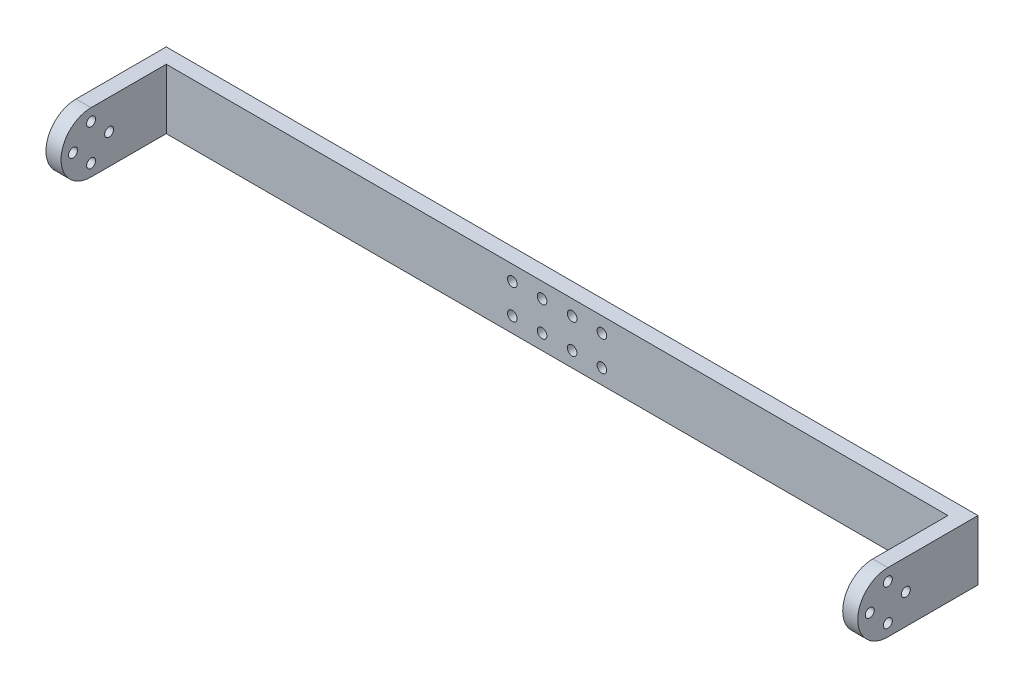
ISO-10303-21;
HEADER;
FILE_DESCRIPTION(('STEP AP214'),'2;1');
FILE_NAME('part.step','',(''),(''),'','','');
FILE_SCHEMA(('AUTOMOTIVE_DESIGN { 1 0 10303 214 1 1 1 1 }'));
ENDSEC;
DATA;
#1=APPLICATION_CONTEXT('core data for automotive mechanical design processes');
#2=APPLICATION_PROTOCOL_DEFINITION('international standard','automotive_design',2000,#1);
#3=PRODUCT_CONTEXT('',#1,'mechanical');
#4=PRODUCT('Part','Part','',(#3));
#5=PRODUCT_RELATED_PRODUCT_CATEGORY('part','',(#4));
#6=PRODUCT_DEFINITION_FORMATION('','',#4);
#7=PRODUCT_DEFINITION_CONTEXT('part definition',#1,'design');
#8=PRODUCT_DEFINITION('design','',#6,#7);
#9=PRODUCT_DEFINITION_SHAPE('','',#8);
#10=(LENGTH_UNIT() NAMED_UNIT(*) SI_UNIT(.MILLI.,.METRE.));
#11=(NAMED_UNIT(*) PLANE_ANGLE_UNIT() SI_UNIT($,.RADIAN.));
#12=(NAMED_UNIT(*) SI_UNIT($,.STERADIAN.) SOLID_ANGLE_UNIT());
#13=UNCERTAINTY_MEASURE_WITH_UNIT(LENGTH_MEASURE(1.E-05),#10,'distance_accuracy_value','');
#14=(GEOMETRIC_REPRESENTATION_CONTEXT(3) GLOBAL_UNCERTAINTY_ASSIGNED_CONTEXT((#13)) GLOBAL_UNIT_ASSIGNED_CONTEXT((#10,
#11,#12)) REPRESENTATION_CONTEXT('',''));
#15=CARTESIAN_POINT('',(0.,0.,0.));
#16=DIRECTION('',(0.,0.,1.));
#17=DIRECTION('',(1.,0.,0.));
#18=AXIS2_PLACEMENT_3D('',#15,#16,#17);
#19=CARTESIAN_POINT('',(135.,10.,5.));
#20=DIRECTION('',(-1.,0.,0.));
#21=DIRECTION('',(0.,0.,1.));
#22=AXIS2_PLACEMENT_3D('',#19,#20,#21);
#23=PLANE('',#22);
#24=CARTESIAN_POINT('',(135.,0.,24.));
#25=DIRECTION('',(-1.,0.,0.));
#26=DIRECTION('',(0.,0.,1.));
#27=AXIS2_PLACEMENT_3D('',#24,#25,#26);
#28=CIRCLE('',#27,1.5);
#29=CARTESIAN_POINT('',(135.,0.,25.5));
#30=VERTEX_POINT('',#29);
#31=EDGE_CURVE('E171',#30,#30,#28,.T.);
#32=ORIENTED_EDGE('',*,*,#31,.T.);
#33=EDGE_LOOP('',(#32));
#34=FACE_BOUND('',#33,.T.);
#35=CARTESIAN_POINT('',(135.,0.,36.));
#36=DIRECTION('',(-1.,0.,0.));
#37=DIRECTION('',(0.,0.,1.));
#38=AXIS2_PLACEMENT_3D('',#35,#36,#37);
#39=CIRCLE('',#38,1.5);
#40=CARTESIAN_POINT('',(135.,0.,37.5));
#41=VERTEX_POINT('',#40);
#42=EDGE_CURVE('E358',#41,#41,#39,.T.);
#43=ORIENTED_EDGE('',*,*,#42,.T.);
#44=EDGE_LOOP('',(#43));
#45=FACE_BOUND('',#44,.T.);
#46=CARTESIAN_POINT('',(135.,6.,30.));
#47=DIRECTION('',(-1.,0.,0.));
#48=DIRECTION('',(0.,0.,1.));
#49=AXIS2_PLACEMENT_3D('',#46,#47,#48);
#50=CIRCLE('',#49,1.5);
#51=CARTESIAN_POINT('',(135.,6.,31.5));
#52=VERTEX_POINT('',#51);
#53=EDGE_CURVE('E362',#52,#52,#50,.T.);
#54=ORIENTED_EDGE('',*,*,#53,.T.);
#55=EDGE_LOOP('',(#54));
#56=FACE_BOUND('',#55,.T.);
#57=CARTESIAN_POINT('',(135.,-6.,30.));
#58=DIRECTION('',(-1.,0.,0.));
#59=DIRECTION('',(0.,0.,1.));
#60=AXIS2_PLACEMENT_3D('',#57,#58,#59);
#61=CIRCLE('',#60,1.5);
#62=CARTESIAN_POINT('',(135.,-6.,31.5));
#63=VERTEX_POINT('',#62);
#64=EDGE_CURVE('E365',#63,#63,#61,.T.);
#65=ORIENTED_EDGE('',*,*,#64,.T.);
#66=EDGE_LOOP('',(#65));
#67=FACE_BOUND('',#66,.T.);
#68=CARTESIAN_POINT('',(135.,0.,30.));
#69=DIRECTION('',(1.,0.,0.));
#70=DIRECTION('',(0.,0.,-1.));
#71=AXIS2_PLACEMENT_3D('',#68,#69,#70);
#72=CIRCLE('',#71,10.);
#73=CARTESIAN_POINT('',(135.,10.,30.));
#74=VERTEX_POINT('',#73);
#75=CARTESIAN_POINT('',(135.,-10.,30.));
#76=VERTEX_POINT('',#75);
#77=EDGE_CURVE('E142',#74,#76,#72,.T.);
#78=ORIENTED_EDGE('',*,*,#77,.T.);
#79=DIRECTION('',(0.,0.,-1.));
#80=VECTOR('',#79,1.);
#81=CARTESIAN_POINT('',(135.,-10.,5.));
#82=LINE('',#81,#80);
#83=CARTESIAN_POINT('',(135.,-10.,0.));
#84=VERTEX_POINT('',#83);
#85=EDGE_CURVE('E157',#76,#84,#82,.T.);
#86=ORIENTED_EDGE('',*,*,#85,.T.);
#87=DIRECTION('',(0.,1.,0.));
#88=VECTOR('',#87,1.);
#89=CARTESIAN_POINT('',(135.,10.,0.));
#90=LINE('',#89,#88);
#91=CARTESIAN_POINT('',(135.,10.,0.));
#92=VERTEX_POINT('',#91);
#93=EDGE_CURVE('E287',#84,#92,#90,.T.);
#94=ORIENTED_EDGE('',*,*,#93,.T.);
#95=DIRECTION('',(0.,0.,-1.));
#96=VECTOR('',#95,1.);
#97=CARTESIAN_POINT('',(135.,10.,5.));
#98=LINE('',#97,#96);
#99=EDGE_CURVE('E12',#74,#92,#98,.T.);
#100=ORIENTED_EDGE('',*,*,#99,.F.);
#101=EDGE_LOOP('',(#78,#86,#94,#100));
#102=FACE_BOUND('',#101,.T.);
#103=ADVANCED_FACE('F60',(#34,#45,#56,#67,#102),#23,.F.);
#104=CARTESIAN_POINT('',(-135.,10.,5.));
#105=DIRECTION('',(1.,0.,0.));
#106=DIRECTION('',(0.,0.,-1.));
#107=AXIS2_PLACEMENT_3D('',#104,#105,#106);
#108=PLANE('',#107);
#109=CARTESIAN_POINT('',(-135.,0.,24.));
#110=DIRECTION('',(-1.,0.,0.));
#111=DIRECTION('',(0.,0.,1.));
#112=AXIS2_PLACEMENT_3D('',#109,#110,#111);
#113=CIRCLE('',#112,1.5);
#114=CARTESIAN_POINT('',(-135.,0.,25.5));
#115=VERTEX_POINT('',#114);
#116=EDGE_CURVE('E385',#115,#115,#113,.T.);
#117=ORIENTED_EDGE('',*,*,#116,.F.);
#118=EDGE_LOOP('',(#117));
#119=FACE_BOUND('',#118,.T.);
#120=CARTESIAN_POINT('',(-135.,0.,36.));
#121=DIRECTION('',(-1.,0.,0.));
#122=DIRECTION('',(0.,0.,1.));
#123=AXIS2_PLACEMENT_3D('',#120,#121,#122);
#124=CIRCLE('',#123,1.5);
#125=CARTESIAN_POINT('',(-135.,0.,37.5));
#126=VERTEX_POINT('',#125);
#127=EDGE_CURVE('E379',#126,#126,#124,.T.);
#128=ORIENTED_EDGE('',*,*,#127,.F.);
#129=EDGE_LOOP('',(#128));
#130=FACE_BOUND('',#129,.T.);
#131=CARTESIAN_POINT('',(-135.,6.,30.));
#132=DIRECTION('',(-1.,0.,0.));
#133=DIRECTION('',(0.,0.,1.));
#134=AXIS2_PLACEMENT_3D('',#131,#132,#133);
#135=CIRCLE('',#134,1.5);
#136=CARTESIAN_POINT('',(-135.,6.,31.5));
#137=VERTEX_POINT('',#136);
#138=EDGE_CURVE('E368',#137,#137,#135,.T.);
#139=ORIENTED_EDGE('',*,*,#138,.F.);
#140=EDGE_LOOP('',(#139));
#141=FACE_BOUND('',#140,.T.);
#142=CARTESIAN_POINT('',(-135.,-6.,30.));
#143=DIRECTION('',(-1.,0.,0.));
#144=DIRECTION('',(0.,0.,1.));
#145=AXIS2_PLACEMENT_3D('',#142,#143,#144);
#146=CIRCLE('',#145,1.5);
#147=CARTESIAN_POINT('',(-135.,-6.,31.5));
#148=VERTEX_POINT('',#147);
#149=EDGE_CURVE('E369',#148,#148,#146,.T.);
#150=ORIENTED_EDGE('',*,*,#149,.F.);
#151=EDGE_LOOP('',(#150));
#152=FACE_BOUND('',#151,.T.);
#153=DIRECTION('',(0.,0.,-1.));
#154=VECTOR('',#153,1.);
#155=CARTESIAN_POINT('',(-135.,-10.,5.));
#156=LINE('',#155,#154);
#157=CARTESIAN_POINT('',(-135.,-10.,30.));
#158=VERTEX_POINT('',#157);
#159=CARTESIAN_POINT('',(-135.,-10.,0.));
#160=VERTEX_POINT('',#159);
#161=EDGE_CURVE('E146',#158,#160,#156,.T.);
#162=ORIENTED_EDGE('',*,*,#161,.F.);
#163=CARTESIAN_POINT('',(-135.,0.,30.));
#164=DIRECTION('',(1.,0.,0.));
#165=DIRECTION('',(0.,0.,-1.));
#166=AXIS2_PLACEMENT_3D('',#163,#164,#165);
#167=CIRCLE('',#166,10.);
#168=CARTESIAN_POINT('',(-135.,10.,30.));
#169=VERTEX_POINT('',#168);
#170=EDGE_CURVE('E130',#169,#158,#167,.T.);
#171=ORIENTED_EDGE('',*,*,#170,.F.);
#172=DIRECTION('',(0.,0.,-1.));
#173=VECTOR('',#172,1.);
#174=CARTESIAN_POINT('',(-135.,10.,5.));
#175=LINE('',#174,#173);
#176=CARTESIAN_POINT('',(-135.,10.,0.));
#177=VERTEX_POINT('',#176);
#178=EDGE_CURVE('E69',#169,#177,#175,.T.);
#179=ORIENTED_EDGE('',*,*,#178,.T.);
#180=DIRECTION('',(0.,-1.,0.));
#181=VECTOR('',#180,1.);
#182=CARTESIAN_POINT('',(-135.,10.,0.));
#183=LINE('',#182,#181);
#184=EDGE_CURVE('E154',#177,#160,#183,.T.);
#185=ORIENTED_EDGE('',*,*,#184,.T.);
#186=EDGE_LOOP('',(#162,#171,#179,#185));
#187=FACE_BOUND('',#186,.T.);
#188=ADVANCED_FACE('F152',(#119,#130,#141,#152,#187),#108,.F.);
#189=CARTESIAN_POINT('',(-130.,10.,40.));
#190=DIRECTION('',(-1.,0.,0.));
#191=DIRECTION('',(0.,0.,1.));
#192=AXIS2_PLACEMENT_3D('',#189,#190,#191);
#193=PLANE('',#192);
#194=CARTESIAN_POINT('',(-130.,0.,24.));
#195=DIRECTION('',(-1.,0.,0.));
#196=DIRECTION('',(0.,0.,1.));
#197=AXIS2_PLACEMENT_3D('',#194,#195,#196);
#198=CIRCLE('',#197,1.5);
#199=CARTESIAN_POINT('',(-130.,0.,25.5));
#200=VERTEX_POINT('',#199);
#201=EDGE_CURVE('E193',#200,#200,#198,.T.);
#202=ORIENTED_EDGE('',*,*,#201,.T.);
#203=EDGE_LOOP('',(#202));
#204=FACE_BOUND('',#203,.T.);
#205=CARTESIAN_POINT('',(-130.,0.,36.));
#206=DIRECTION('',(-1.,0.,0.));
#207=DIRECTION('',(0.,0.,1.));
#208=AXIS2_PLACEMENT_3D('',#205,#206,#207);
#209=CIRCLE('',#208,1.5);
#210=CARTESIAN_POINT('',(-130.,0.,37.5));
#211=VERTEX_POINT('',#210);
#212=EDGE_CURVE('E179',#211,#211,#209,.T.);
#213=ORIENTED_EDGE('',*,*,#212,.T.);
#214=EDGE_LOOP('',(#213));
#215=FACE_BOUND('',#214,.T.);
#216=CARTESIAN_POINT('',(-130.,6.,30.));
#217=DIRECTION('',(-1.,0.,0.));
#218=DIRECTION('',(0.,0.,1.));
#219=AXIS2_PLACEMENT_3D('',#216,#217,#218);
#220=CIRCLE('',#219,1.5);
#221=CARTESIAN_POINT('',(-130.,6.,31.5));
#222=VERTEX_POINT('',#221);
#223=EDGE_CURVE('E175',#222,#222,#220,.T.);
#224=ORIENTED_EDGE('',*,*,#223,.T.);
#225=EDGE_LOOP('',(#224));
#226=FACE_BOUND('',#225,.T.);
#227=CARTESIAN_POINT('',(-130.,-6.,30.));
#228=DIRECTION('',(-1.,0.,0.));
#229=DIRECTION('',(0.,0.,1.));
#230=AXIS2_PLACEMENT_3D('',#227,#228,#229);
#231=CIRCLE('',#230,1.5);
#232=CARTESIAN_POINT('',(-130.,-6.,31.5));
#233=VERTEX_POINT('',#232);
#234=EDGE_CURVE('E170',#233,#233,#231,.T.);
#235=ORIENTED_EDGE('',*,*,#234,.T.);
#236=EDGE_LOOP('',(#235));
#237=FACE_BOUND('',#236,.T.);
#238=CARTESIAN_POINT('',(-130.,0.,30.));
#239=DIRECTION('',(-1.,0.,0.));
#240=DIRECTION('',(0.,0.,1.));
#241=AXIS2_PLACEMENT_3D('',#238,#239,#240);
#242=CIRCLE('',#241,10.);
#243=CARTESIAN_POINT('',(-130.,-10.,30.));
#244=VERTEX_POINT('',#243);
#245=CARTESIAN_POINT('',(-130.,10.,30.));
#246=VERTEX_POINT('',#245);
#247=EDGE_CURVE('E204',#244,#246,#242,.T.);
#248=ORIENTED_EDGE('',*,*,#247,.F.);
#249=DIRECTION('',(0.,0.,-1.));
#250=VECTOR('',#249,1.);
#251=CARTESIAN_POINT('',(-130.,-10.,40.));
#252=LINE('',#251,#250);
#253=CARTESIAN_POINT('',(-130.,-10.,5.));
#254=VERTEX_POINT('',#253);
#255=EDGE_CURVE('E148',#244,#254,#252,.T.);
#256=ORIENTED_EDGE('',*,*,#255,.T.);
#257=DIRECTION('',(0.,1.,0.));
#258=VECTOR('',#257,1.);
#259=CARTESIAN_POINT('',(-130.,10.,5.));
#260=LINE('',#259,#258);
#261=CARTESIAN_POINT('',(-130.,10.,5.));
#262=VERTEX_POINT('',#261);
#263=EDGE_CURVE('E278',#254,#262,#260,.T.);
#264=ORIENTED_EDGE('',*,*,#263,.T.);
#265=DIRECTION('',(0.,0.,-1.));
#266=VECTOR('',#265,1.);
#267=CARTESIAN_POINT('',(-130.,10.,40.));
#268=LINE('',#267,#266);
#269=EDGE_CURVE('E282',#246,#262,#268,.T.);
#270=ORIENTED_EDGE('',*,*,#269,.F.);
#271=EDGE_LOOP('',(#248,#256,#264,#270));
#272=FACE_BOUND('',#271,.T.);
#273=ADVANCED_FACE('F350',(#204,#215,#226,#237,#272),#193,.F.);
#274=CARTESIAN_POINT('',(130.,-10.,40.));
#275=DIRECTION('',(1.,0.,0.));
#276=DIRECTION('',(0.,0.,-1.));
#277=AXIS2_PLACEMENT_3D('',#274,#275,#276);
#278=PLANE('',#277);
#279=CARTESIAN_POINT('',(130.,0.,24.));
#280=DIRECTION('',(1.,0.,0.));
#281=DIRECTION('',(0.,0.,-1.));
#282=AXIS2_PLACEMENT_3D('',#279,#280,#281);
#283=CIRCLE('',#282,1.5);
#284=CARTESIAN_POINT('',(130.,0.,22.5));
#285=VERTEX_POINT('',#284);
#286=EDGE_CURVE('E63',#285,#285,#283,.T.);
#287=ORIENTED_EDGE('',*,*,#286,.T.);
#288=EDGE_LOOP('',(#287));
#289=FACE_BOUND('',#288,.T.);
#290=CARTESIAN_POINT('',(130.,0.,36.));
#291=DIRECTION('',(1.,0.,0.));
#292=DIRECTION('',(0.,0.,-1.));
#293=AXIS2_PLACEMENT_3D('',#290,#291,#292);
#294=CIRCLE('',#293,1.5);
#295=CARTESIAN_POINT('',(130.,0.,34.5));
#296=VERTEX_POINT('',#295);
#297=EDGE_CURVE('E176',#296,#296,#294,.T.);
#298=ORIENTED_EDGE('',*,*,#297,.T.);
#299=EDGE_LOOP('',(#298));
#300=FACE_BOUND('',#299,.T.);
#301=CARTESIAN_POINT('',(130.,6.,30.));
#302=DIRECTION('',(1.,0.,0.));
#303=DIRECTION('',(0.,0.,-1.));
#304=AXIS2_PLACEMENT_3D('',#301,#302,#303);
#305=CIRCLE('',#304,1.5);
#306=CARTESIAN_POINT('',(130.,6.,28.5));
#307=VERTEX_POINT('',#306);
#308=EDGE_CURVE('E172',#307,#307,#305,.T.);
#309=ORIENTED_EDGE('',*,*,#308,.T.);
#310=EDGE_LOOP('',(#309));
#311=FACE_BOUND('',#310,.T.);
#312=CARTESIAN_POINT('',(130.,-6.,30.));
#313=DIRECTION('',(1.,0.,0.));
#314=DIRECTION('',(0.,0.,-1.));
#315=AXIS2_PLACEMENT_3D('',#312,#313,#314);
#316=CIRCLE('',#315,1.5);
#317=CARTESIAN_POINT('',(130.,-6.,28.5));
#318=VERTEX_POINT('',#317);
#319=EDGE_CURVE('E166',#318,#318,#316,.T.);
#320=ORIENTED_EDGE('',*,*,#319,.T.);
#321=EDGE_LOOP('',(#320));
#322=FACE_BOUND('',#321,.T.);
#323=DIRECTION('',(0.,0.,-1.));
#324=VECTOR('',#323,1.);
#325=CARTESIAN_POINT('',(130.,-10.,40.));
#326=LINE('',#325,#324);
#327=CARTESIAN_POINT('',(130.,-10.,30.));
#328=VERTEX_POINT('',#327);
#329=CARTESIAN_POINT('',(130.,-10.,5.));
#330=VERTEX_POINT('',#329);
#331=EDGE_CURVE('E85',#328,#330,#326,.T.);
#332=ORIENTED_EDGE('',*,*,#331,.F.);
#333=CARTESIAN_POINT('',(130.,0.,30.));
#334=DIRECTION('',(1.,0.,0.));
#335=DIRECTION('',(0.,0.,-1.));
#336=AXIS2_PLACEMENT_3D('',#333,#334,#335);
#337=CIRCLE('',#336,10.);
#338=CARTESIAN_POINT('',(130.,10.,30.));
#339=VERTEX_POINT('',#338);
#340=EDGE_CURVE('E201',#339,#328,#337,.T.);
#341=ORIENTED_EDGE('',*,*,#340,.F.);
#342=DIRECTION('',(0.,0.,-1.));
#343=VECTOR('',#342,1.);
#344=CARTESIAN_POINT('',(130.,10.,40.));
#345=LINE('',#344,#343);
#346=CARTESIAN_POINT('',(130.,10.,5.));
#347=VERTEX_POINT('',#346);
#348=EDGE_CURVE('E77',#339,#347,#345,.T.);
#349=ORIENTED_EDGE('',*,*,#348,.T.);
#350=DIRECTION('',(0.,-1.,0.));
#351=VECTOR('',#350,1.);
#352=CARTESIAN_POINT('',(130.,-10.,5.));
#353=LINE('',#352,#351);
#354=EDGE_CURVE('E271',#347,#330,#353,.T.);
#355=ORIENTED_EDGE('',*,*,#354,.T.);
#356=EDGE_LOOP('',(#332,#341,#349,#355));
#357=FACE_BOUND('',#356,.T.);
#358=ADVANCED_FACE('F320',(#289,#300,#311,#322,#357),#278,.F.);
#359=CARTESIAN_POINT('',(-135.,-10.,5.));
#360=DIRECTION('',(0.,1.,0.));
#361=DIRECTION('',(0.,0.,1.));
#362=AXIS2_PLACEMENT_3D('',#359,#360,#361);
#363=PLANE('',#362);
#364=DIRECTION('',(1.,0.,0.));
#365=VECTOR('',#364,1.);
#366=CARTESIAN_POINT('',(-135.,-10.,30.));
#367=LINE('',#366,#365);
#368=EDGE_CURVE('E133',#158,#244,#367,.T.);
#369=ORIENTED_EDGE('',*,*,#368,.F.);
#370=ORIENTED_EDGE('',*,*,#161,.T.);
#371=DIRECTION('',(1.,0.,0.));
#372=VECTOR('',#371,1.);
#373=CARTESIAN_POINT('',(-135.,-10.,0.));
#374=LINE('',#373,#372);
#375=EDGE_CURVE('E292',#160,#84,#374,.T.);
#376=ORIENTED_EDGE('',*,*,#375,.T.);
#377=ORIENTED_EDGE('',*,*,#85,.F.);
#378=EDGE_CURVE('E150',#328,#76,#367,.T.);
#379=ORIENTED_EDGE('',*,*,#378,.F.);
#380=ORIENTED_EDGE('',*,*,#331,.T.);
#381=DIRECTION('',(1.,0.,0.));
#382=VECTOR('',#381,1.);
#383=CARTESIAN_POINT('',(-135.,-10.,5.));
#384=LINE('',#383,#382);
#385=EDGE_CURVE('E162',#254,#330,#384,.T.);
#386=ORIENTED_EDGE('',*,*,#385,.F.);
#387=ORIENTED_EDGE('',*,*,#255,.F.);
#388=EDGE_LOOP('',(#369,#370,#376,#377,#379,#380,#386,#387));
#389=FACE_BOUND('',#388,.T.);
#390=ADVANCED_FACE('F144',(#389),#363,.F.);
#391=CARTESIAN_POINT('',(0.,0.,5.));
#392=DIRECTION('',(0.,0.,1.));
#393=DIRECTION('',(1.,0.,0.));
#394=AXIS2_PLACEMENT_3D('',#391,#392,#393);
#395=PLANE('',#394);
#396=CARTESIAN_POINT('',(-14.9,-4.95,5.));
#397=DIRECTION('',(0.,0.,1.));
#398=DIRECTION('',(1.,0.,0.));
#399=AXIS2_PLACEMENT_3D('',#396,#397,#398);
#400=CIRCLE('',#399,1.6);
#401=CARTESIAN_POINT('',(-13.3,-4.95,5.));
#402=VERTEX_POINT('',#401);
#403=EDGE_CURVE('E267',#402,#402,#400,.T.);
#404=ORIENTED_EDGE('',*,*,#403,.F.);
#405=EDGE_LOOP('',(#404));
#406=FACE_BOUND('',#405,.T.);
#407=CARTESIAN_POINT('',(5.,4.95,5.));
#408=DIRECTION('',(0.,0.,1.));
#409=DIRECTION('',(1.,0.,0.));
#410=AXIS2_PLACEMENT_3D('',#407,#408,#409);
#411=CIRCLE('',#410,1.6);
#412=CARTESIAN_POINT('',(6.6,4.95,5.));
#413=VERTEX_POINT('',#412);
#414=EDGE_CURVE('E263',#413,#413,#411,.T.);
#415=ORIENTED_EDGE('',*,*,#414,.F.);
#416=EDGE_LOOP('',(#415));
#417=FACE_BOUND('',#416,.T.);
#418=CARTESIAN_POINT('',(14.9,4.95,5.));
#419=DIRECTION('',(0.,0.,1.));
#420=DIRECTION('',(1.,0.,0.));
#421=AXIS2_PLACEMENT_3D('',#418,#419,#420);
#422=CIRCLE('',#421,1.6);
#423=CARTESIAN_POINT('',(16.5,4.95,5.));
#424=VERTEX_POINT('',#423);
#425=EDGE_CURVE('E259',#424,#424,#422,.T.);
#426=ORIENTED_EDGE('',*,*,#425,.F.);
#427=EDGE_LOOP('',(#426));
#428=FACE_BOUND('',#427,.T.);
#429=CARTESIAN_POINT('',(-14.9,4.95,5.));
#430=DIRECTION('',(0.,0.,1.));
#431=DIRECTION('',(1.,0.,0.));
#432=AXIS2_PLACEMENT_3D('',#429,#430,#431);
#433=CIRCLE('',#432,1.6);
#434=CARTESIAN_POINT('',(-13.3,4.95,5.));
#435=VERTEX_POINT('',#434);
#436=EDGE_CURVE('E255',#435,#435,#433,.T.);
#437=ORIENTED_EDGE('',*,*,#436,.F.);
#438=EDGE_LOOP('',(#437));
#439=FACE_BOUND('',#438,.T.);
#440=CARTESIAN_POINT('',(-5.,-4.95,5.));
#441=DIRECTION('',(0.,0.,1.));
#442=DIRECTION('',(1.,0.,0.));
#443=AXIS2_PLACEMENT_3D('',#440,#441,#442);
#444=CIRCLE('',#443,1.6);
#445=CARTESIAN_POINT('',(-3.4,-4.95,5.));
#446=VERTEX_POINT('',#445);
#447=EDGE_CURVE('E251',#446,#446,#444,.T.);
#448=ORIENTED_EDGE('',*,*,#447,.F.);
#449=EDGE_LOOP('',(#448));
#450=FACE_BOUND('',#449,.T.);
#451=CARTESIAN_POINT('',(5.,-4.95,5.));
#452=DIRECTION('',(0.,0.,1.));
#453=DIRECTION('',(1.,0.,0.));
#454=AXIS2_PLACEMENT_3D('',#451,#452,#453);
#455=CIRCLE('',#454,1.6);
#456=CARTESIAN_POINT('',(6.6,-4.95,5.));
#457=VERTEX_POINT('',#456);
#458=EDGE_CURVE('E247',#457,#457,#455,.T.);
#459=ORIENTED_EDGE('',*,*,#458,.F.);
#460=EDGE_LOOP('',(#459));
#461=FACE_BOUND('',#460,.T.);
#462=CARTESIAN_POINT('',(14.9,-4.95,5.));
#463=DIRECTION('',(0.,0.,1.));
#464=DIRECTION('',(1.,0.,0.));
#465=AXIS2_PLACEMENT_3D('',#462,#463,#464);
#466=CIRCLE('',#465,1.6);
#467=CARTESIAN_POINT('',(16.5,-4.95,5.));
#468=VERTEX_POINT('',#467);
#469=EDGE_CURVE('E243',#468,#468,#466,.T.);
#470=ORIENTED_EDGE('',*,*,#469,.F.);
#471=EDGE_LOOP('',(#470));
#472=FACE_BOUND('',#471,.T.);
#473=CARTESIAN_POINT('',(-5.,4.95,5.));
#474=DIRECTION('',(0.,0.,1.));
#475=DIRECTION('',(1.,0.,0.));
#476=AXIS2_PLACEMENT_3D('',#473,#474,#475);
#477=CIRCLE('',#476,1.6);
#478=CARTESIAN_POINT('',(-3.4,4.95,5.));
#479=VERTEX_POINT('',#478);
#480=EDGE_CURVE('E239',#479,#479,#477,.T.);
#481=ORIENTED_EDGE('',*,*,#480,.F.);
#482=EDGE_LOOP('',(#481));
#483=FACE_BOUND('',#482,.T.);
#484=ORIENTED_EDGE('',*,*,#385,.T.);
#485=ORIENTED_EDGE('',*,*,#354,.F.);
#486=DIRECTION('',(-1.,0.,0.));
#487=VECTOR('',#486,1.);
#488=CARTESIAN_POINT('',(-135.,10.,5.));
#489=LINE('',#488,#487);
#490=EDGE_CURVE('E288',#347,#262,#489,.T.);
#491=ORIENTED_EDGE('',*,*,#490,.T.);
#492=ORIENTED_EDGE('',*,*,#263,.F.);
#493=EDGE_LOOP('',(#484,#485,#491,#492));
#494=FACE_BOUND('',#493,.T.);
#495=ADVANCED_FACE('F406',(#406,#417,#428,#439,#450,#461,#472,#483,#494),#395,.T.);
#496=CARTESIAN_POINT('',(-135.,10.,5.));
#497=DIRECTION('',(0.,-1.,0.));
#498=DIRECTION('',(0.,0.,-1.));
#499=AXIS2_PLACEMENT_3D('',#496,#497,#498);
#500=PLANE('',#499);
#501=ORIENTED_EDGE('',*,*,#178,.F.);
#502=DIRECTION('',(1.,0.,0.));
#503=VECTOR('',#502,1.);
#504=CARTESIAN_POINT('',(-135.,10.,30.));
#505=LINE('',#504,#503);
#506=EDGE_CURVE('E136',#169,#246,#505,.T.);
#507=ORIENTED_EDGE('',*,*,#506,.T.);
#508=ORIENTED_EDGE('',*,*,#269,.T.);
#509=ORIENTED_EDGE('',*,*,#490,.F.);
#510=ORIENTED_EDGE('',*,*,#348,.F.);
#511=EDGE_CURVE('E141',#339,#74,#505,.T.);
#512=ORIENTED_EDGE('',*,*,#511,.T.);
#513=ORIENTED_EDGE('',*,*,#99,.T.);
#514=DIRECTION('',(-1.,0.,0.));
#515=VECTOR('',#514,1.);
#516=CARTESIAN_POINT('',(-135.,10.,0.));
#517=LINE('',#516,#515);
#518=EDGE_CURVE('E298',#92,#177,#517,.T.);
#519=ORIENTED_EDGE('',*,*,#518,.T.);
#520=EDGE_LOOP('',(#501,#507,#508,#509,#510,#512,#513,#519));
#521=FACE_BOUND('',#520,.T.);
#522=ADVANCED_FACE('F402',(#521),#500,.F.);
#523=CARTESIAN_POINT('',(0.,0.,0.));
#524=DIRECTION('',(0.,0.,1.));
#525=DIRECTION('',(1.,0.,0.));
#526=AXIS2_PLACEMENT_3D('',#523,#524,#525);
#527=PLANE('',#526);
#528=CARTESIAN_POINT('',(-14.9,-4.95,0.));
#529=DIRECTION('',(0.,0.,-1.));
#530=DIRECTION('',(1.,0.,0.));
#531=AXIS2_PLACEMENT_3D('',#528,#529,#530);
#532=CIRCLE('',#531,1.6);
#533=CARTESIAN_POINT('',(-13.3,-4.95,0.));
#534=VERTEX_POINT('',#533);
#535=EDGE_CURVE('E212',#534,#534,#532,.T.);
#536=ORIENTED_EDGE('',*,*,#535,.F.);
#537=EDGE_LOOP('',(#536));
#538=FACE_BOUND('',#537,.T.);
#539=CARTESIAN_POINT('',(5.,4.95,0.));
#540=DIRECTION('',(0.,0.,-1.));
#541=DIRECTION('',(1.,0.,0.));
#542=AXIS2_PLACEMENT_3D('',#539,#540,#541);
#543=CIRCLE('',#542,1.6);
#544=CARTESIAN_POINT('',(6.6,4.95,0.));
#545=VERTEX_POINT('',#544);
#546=EDGE_CURVE('E220',#545,#545,#543,.T.);
#547=ORIENTED_EDGE('',*,*,#546,.F.);
#548=EDGE_LOOP('',(#547));
#549=FACE_BOUND('',#548,.T.);
#550=CARTESIAN_POINT('',(14.9,4.95,0.));
#551=DIRECTION('',(0.,0.,-1.));
#552=DIRECTION('',(1.,0.,0.));
#553=AXIS2_PLACEMENT_3D('',#550,#551,#552);
#554=CIRCLE('',#553,1.6);
#555=CARTESIAN_POINT('',(16.5,4.95,0.));
#556=VERTEX_POINT('',#555);
#557=EDGE_CURVE('E224',#556,#556,#554,.T.);
#558=ORIENTED_EDGE('',*,*,#557,.F.);
#559=EDGE_LOOP('',(#558));
#560=FACE_BOUND('',#559,.T.);
#561=CARTESIAN_POINT('',(-14.9,4.95,0.));
#562=DIRECTION('',(0.,0.,-1.));
#563=DIRECTION('',(-1.,0.,0.));
#564=AXIS2_PLACEMENT_3D('',#561,#562,#563);
#565=CIRCLE('',#564,1.6);
#566=CARTESIAN_POINT('',(-16.5,4.95,0.));
#567=VERTEX_POINT('',#566);
#568=EDGE_CURVE('E228',#567,#567,#565,.T.);
#569=ORIENTED_EDGE('',*,*,#568,.F.);
#570=EDGE_LOOP('',(#569));
#571=FACE_BOUND('',#570,.T.);
#572=CARTESIAN_POINT('',(-5.,-4.95,0.));
#573=DIRECTION('',(0.,0.,-1.));
#574=DIRECTION('',(1.,0.,0.));
#575=AXIS2_PLACEMENT_3D('',#572,#573,#574);
#576=CIRCLE('',#575,1.6);
#577=CARTESIAN_POINT('',(-3.4,-4.95,0.));
#578=VERTEX_POINT('',#577);
#579=EDGE_CURVE('E208',#578,#578,#576,.T.);
#580=ORIENTED_EDGE('',*,*,#579,.F.);
#581=EDGE_LOOP('',(#580));
#582=FACE_BOUND('',#581,.T.);
#583=CARTESIAN_POINT('',(5.,-4.95,0.));
#584=DIRECTION('',(0.,0.,-1.));
#585=DIRECTION('',(-1.,0.,0.));
#586=AXIS2_PLACEMENT_3D('',#583,#584,#585);
#587=CIRCLE('',#586,1.6);
#588=CARTESIAN_POINT('',(3.4,-4.95,0.));
#589=VERTEX_POINT('',#588);
#590=EDGE_CURVE('E213',#589,#589,#587,.T.);
#591=ORIENTED_EDGE('',*,*,#590,.F.);
#592=EDGE_LOOP('',(#591));
#593=FACE_BOUND('',#592,.T.);
#594=CARTESIAN_POINT('',(14.9,-4.95,0.));
#595=DIRECTION('',(0.,0.,-1.));
#596=DIRECTION('',(-1.,0.,0.));
#597=AXIS2_PLACEMENT_3D('',#594,#595,#596);
#598=CIRCLE('',#597,1.6);
#599=CARTESIAN_POINT('',(13.3,-4.95,0.));
#600=VERTEX_POINT('',#599);
#601=EDGE_CURVE('E207',#600,#600,#598,.T.);
#602=ORIENTED_EDGE('',*,*,#601,.F.);
#603=EDGE_LOOP('',(#602));
#604=FACE_BOUND('',#603,.T.);
#605=CARTESIAN_POINT('',(-5.,4.95,0.));
#606=DIRECTION('',(0.,0.,-1.));
#607=DIRECTION('',(-1.,0.,0.));
#608=AXIS2_PLACEMENT_3D('',#605,#606,#607);
#609=CIRCLE('',#608,1.6);
#610=CARTESIAN_POINT('',(-6.6,4.95,0.));
#611=VERTEX_POINT('',#610);
#612=EDGE_CURVE('E232',#611,#611,#609,.T.);
#613=ORIENTED_EDGE('',*,*,#612,.F.);
#614=EDGE_LOOP('',(#613));
#615=FACE_BOUND('',#614,.T.);
#616=ORIENTED_EDGE('',*,*,#93,.F.);
#617=ORIENTED_EDGE('',*,*,#375,.F.);
#618=ORIENTED_EDGE('',*,*,#184,.F.);
#619=ORIENTED_EDGE('',*,*,#518,.F.);
#620=EDGE_LOOP('',(#616,#617,#618,#619));
#621=FACE_BOUND('',#620,.T.);
#622=ADVANCED_FACE('F308',(#538,#549,#560,#571,#582,#593,#604,#615,#621),#527,.F.);
#623=CARTESIAN_POINT('',(-5.,4.95,35.));
#624=DIRECTION('',(0.,0.,-1.));
#625=DIRECTION('',(-1.,0.,0.));
#626=AXIS2_PLACEMENT_3D('',#623,#624,#625);
#627=CYLINDRICAL_SURFACE('',#626,1.6);
#628=ORIENTED_EDGE('',*,*,#480,.T.);
#629=EDGE_LOOP('',(#628));
#630=FACE_BOUND('',#629,.T.);
#631=ORIENTED_EDGE('',*,*,#612,.T.);
#632=EDGE_LOOP('',(#631));
#633=FACE_BOUND('',#632,.T.);
#634=ADVANCED_FACE('F420',(#630,#633),#627,.F.);
#635=CARTESIAN_POINT('',(14.9,-4.95,35.));
#636=DIRECTION('',(0.,0.,-1.));
#637=DIRECTION('',(-1.,0.,0.));
#638=AXIS2_PLACEMENT_3D('',#635,#636,#637);
#639=CYLINDRICAL_SURFACE('',#638,1.6);
#640=ORIENTED_EDGE('',*,*,#469,.T.);
#641=EDGE_LOOP('',(#640));
#642=FACE_BOUND('',#641,.T.);
#643=ORIENTED_EDGE('',*,*,#601,.T.);
#644=EDGE_LOOP('',(#643));
#645=FACE_BOUND('',#644,.T.);
#646=ADVANCED_FACE('F426',(#642,#645),#639,.F.);
#647=CARTESIAN_POINT('',(5.,-4.95,35.));
#648=DIRECTION('',(0.,0.,-1.));
#649=DIRECTION('',(-1.,0.,0.));
#650=AXIS2_PLACEMENT_3D('',#647,#648,#649);
#651=CYLINDRICAL_SURFACE('',#650,1.6);
#652=ORIENTED_EDGE('',*,*,#458,.T.);
#653=EDGE_LOOP('',(#652));
#654=FACE_BOUND('',#653,.T.);
#655=ORIENTED_EDGE('',*,*,#590,.T.);
#656=EDGE_LOOP('',(#655));
#657=FACE_BOUND('',#656,.T.);
#658=ADVANCED_FACE('F447',(#654,#657),#651,.F.);
#659=CARTESIAN_POINT('',(-5.,-4.95,35.));
#660=DIRECTION('',(0.,0.,-1.));
#661=DIRECTION('',(-1.,0.,0.));
#662=AXIS2_PLACEMENT_3D('',#659,#660,#661);
#663=CYLINDRICAL_SURFACE('',#662,1.6);
#664=ORIENTED_EDGE('',*,*,#447,.T.);
#665=EDGE_LOOP('',(#664));
#666=FACE_BOUND('',#665,.T.);
#667=ORIENTED_EDGE('',*,*,#579,.T.);
#668=EDGE_LOOP('',(#667));
#669=FACE_BOUND('',#668,.T.);
#670=ADVANCED_FACE('F453',(#666,#669),#663,.F.);
#671=CARTESIAN_POINT('',(-14.9,4.95,35.));
#672=DIRECTION('',(0.,0.,-1.));
#673=DIRECTION('',(-1.,0.,0.));
#674=AXIS2_PLACEMENT_3D('',#671,#672,#673);
#675=CYLINDRICAL_SURFACE('',#674,1.6);
#676=ORIENTED_EDGE('',*,*,#436,.T.);
#677=EDGE_LOOP('',(#676));
#678=FACE_BOUND('',#677,.T.);
#679=ORIENTED_EDGE('',*,*,#568,.T.);
#680=EDGE_LOOP('',(#679));
#681=FACE_BOUND('',#680,.T.);
#682=ADVANCED_FACE('F467',(#678,#681),#675,.F.);
#683=CARTESIAN_POINT('',(14.9,4.95,35.));
#684=DIRECTION('',(0.,0.,-1.));
#685=DIRECTION('',(-1.,0.,0.));
#686=AXIS2_PLACEMENT_3D('',#683,#684,#685);
#687=CYLINDRICAL_SURFACE('',#686,1.6);
#688=ORIENTED_EDGE('',*,*,#425,.T.);
#689=EDGE_LOOP('',(#688));
#690=FACE_BOUND('',#689,.T.);
#691=ORIENTED_EDGE('',*,*,#557,.T.);
#692=EDGE_LOOP('',(#691));
#693=FACE_BOUND('',#692,.T.);
#694=ADVANCED_FACE('F462',(#690,#693),#687,.F.);
#695=CARTESIAN_POINT('',(5.,4.95,35.));
#696=DIRECTION('',(0.,0.,-1.));
#697=DIRECTION('',(-1.,0.,0.));
#698=AXIS2_PLACEMENT_3D('',#695,#696,#697);
#699=CYLINDRICAL_SURFACE('',#698,1.6);
#700=ORIENTED_EDGE('',*,*,#414,.T.);
#701=EDGE_LOOP('',(#700));
#702=FACE_BOUND('',#701,.T.);
#703=ORIENTED_EDGE('',*,*,#546,.T.);
#704=EDGE_LOOP('',(#703));
#705=FACE_BOUND('',#704,.T.);
#706=ADVANCED_FACE('F458',(#702,#705),#699,.F.);
#707=CARTESIAN_POINT('',(-14.9,-4.95,35.));
#708=DIRECTION('',(0.,0.,-1.));
#709=DIRECTION('',(-1.,0.,0.));
#710=AXIS2_PLACEMENT_3D('',#707,#708,#709);
#711=CYLINDRICAL_SURFACE('',#710,1.6);
#712=ORIENTED_EDGE('',*,*,#403,.T.);
#713=EDGE_LOOP('',(#712));
#714=FACE_BOUND('',#713,.T.);
#715=ORIENTED_EDGE('',*,*,#535,.T.);
#716=EDGE_LOOP('',(#715));
#717=FACE_BOUND('',#716,.T.);
#718=ADVANCED_FACE('F461',(#714,#717),#711,.F.);
#719=CARTESIAN_POINT('',(-135.,0.,30.));
#720=DIRECTION('',(1.,0.,0.));
#721=DIRECTION('',(0.,0.,-1.));
#722=AXIS2_PLACEMENT_3D('',#719,#720,#721);
#723=CYLINDRICAL_SURFACE('',#722,10.);
#724=ORIENTED_EDGE('',*,*,#340,.T.);
#725=ORIENTED_EDGE('',*,*,#378,.T.);
#726=ORIENTED_EDGE('',*,*,#77,.F.);
#727=ORIENTED_EDGE('',*,*,#511,.F.);
#728=EDGE_LOOP('',(#724,#725,#726,#727));
#729=FACE_BOUND('',#728,.T.);
#730=ADVANCED_FACE('F314',(#729),#723,.T.);
#731=ORIENTED_EDGE('',*,*,#247,.T.);
#732=ORIENTED_EDGE('',*,*,#506,.F.);
#733=ORIENTED_EDGE('',*,*,#170,.T.);
#734=ORIENTED_EDGE('',*,*,#368,.T.);
#735=EDGE_LOOP('',(#731,#732,#733,#734));
#736=FACE_BOUND('',#735,.T.);
#737=ADVANCED_FACE('F132',(#736),#723,.T.);
#738=CARTESIAN_POINT('',(135.,-6.,30.));
#739=DIRECTION('',(-1.,0.,0.));
#740=DIRECTION('',(0.,0.,1.));
#741=AXIS2_PLACEMENT_3D('',#738,#739,#740);
#742=CYLINDRICAL_SURFACE('',#741,1.5);
#743=ORIENTED_EDGE('',*,*,#64,.F.);
#744=EDGE_LOOP('',(#743));
#745=FACE_BOUND('',#744,.T.);
#746=ORIENTED_EDGE('',*,*,#319,.F.);
#747=EDGE_LOOP('',(#746));
#748=FACE_BOUND('',#747,.T.);
#749=ADVANCED_FACE('F336',(#745,#748),#742,.F.);
#750=CARTESIAN_POINT('',(135.,6.,30.));
#751=DIRECTION('',(-1.,0.,0.));
#752=DIRECTION('',(0.,0.,1.));
#753=AXIS2_PLACEMENT_3D('',#750,#751,#752);
#754=CYLINDRICAL_SURFACE('',#753,1.5);
#755=ORIENTED_EDGE('',*,*,#53,.F.);
#756=EDGE_LOOP('',(#755));
#757=FACE_BOUND('',#756,.T.);
#758=ORIENTED_EDGE('',*,*,#308,.F.);
#759=EDGE_LOOP('',(#758));
#760=FACE_BOUND('',#759,.T.);
#761=ADVANCED_FACE('F337',(#757,#760),#754,.F.);
#762=CARTESIAN_POINT('',(135.,0.,36.));
#763=DIRECTION('',(-1.,0.,0.));
#764=DIRECTION('',(0.,0.,1.));
#765=AXIS2_PLACEMENT_3D('',#762,#763,#764);
#766=CYLINDRICAL_SURFACE('',#765,1.5);
#767=ORIENTED_EDGE('',*,*,#42,.F.);
#768=EDGE_LOOP('',(#767));
#769=FACE_BOUND('',#768,.T.);
#770=ORIENTED_EDGE('',*,*,#297,.F.);
#771=EDGE_LOOP('',(#770));
#772=FACE_BOUND('',#771,.T.);
#773=ADVANCED_FACE('F325',(#769,#772),#766,.F.);
#774=CARTESIAN_POINT('',(135.,0.,24.));
#775=DIRECTION('',(-1.,0.,0.));
#776=DIRECTION('',(0.,0.,1.));
#777=AXIS2_PLACEMENT_3D('',#774,#775,#776);
#778=CYLINDRICAL_SURFACE('',#777,1.5);
#779=ORIENTED_EDGE('',*,*,#31,.F.);
#780=EDGE_LOOP('',(#779));
#781=FACE_BOUND('',#780,.T.);
#782=ORIENTED_EDGE('',*,*,#286,.F.);
#783=EDGE_LOOP('',(#782));
#784=FACE_BOUND('',#783,.T.);
#785=ADVANCED_FACE('F322',(#781,#784),#778,.F.);
#786=ORIENTED_EDGE('',*,*,#149,.T.);
#787=EDGE_LOOP('',(#786));
#788=FACE_BOUND('',#787,.T.);
#789=ORIENTED_EDGE('',*,*,#234,.F.);
#790=EDGE_LOOP('',(#789));
#791=FACE_BOUND('',#790,.T.);
#792=ADVANCED_FACE('F324',(#788,#791),#742,.F.);
#793=ORIENTED_EDGE('',*,*,#138,.T.);
#794=EDGE_LOOP('',(#793));
#795=FACE_BOUND('',#794,.T.);
#796=ORIENTED_EDGE('',*,*,#223,.F.);
#797=EDGE_LOOP('',(#796));
#798=FACE_BOUND('',#797,.T.);
#799=ADVANCED_FACE('F333',(#795,#798),#754,.F.);
#800=ORIENTED_EDGE('',*,*,#127,.T.);
#801=EDGE_LOOP('',(#800));
#802=FACE_BOUND('',#801,.T.);
#803=ORIENTED_EDGE('',*,*,#212,.F.);
#804=EDGE_LOOP('',(#803));
#805=FACE_BOUND('',#804,.T.);
#806=ADVANCED_FACE('F340',(#802,#805),#766,.F.);
#807=ORIENTED_EDGE('',*,*,#116,.T.);
#808=EDGE_LOOP('',(#807));
#809=FACE_BOUND('',#808,.T.);
#810=ORIENTED_EDGE('',*,*,#201,.F.);
#811=EDGE_LOOP('',(#810));
#812=FACE_BOUND('',#811,.T.);
#813=ADVANCED_FACE('F328',(#809,#812),#778,.F.);
#814=CLOSED_SHELL('',(#103,#188,#273,#358,#390,#495,#522,#622,#634,#646,#658,#670,#682,#694,
#706,#718,#730,#737,#749,#761,#773,#785,#792,#799,#806,#813));
#815=MANIFOLD_SOLID_BREP('B2',#814);
#816=ADVANCED_BREP_SHAPE_REPRESENTATION('',(#18,#815),#14);
#817=SHAPE_DEFINITION_REPRESENTATION(#9,#816);
ENDSEC;
END-ISO-10303-21;
